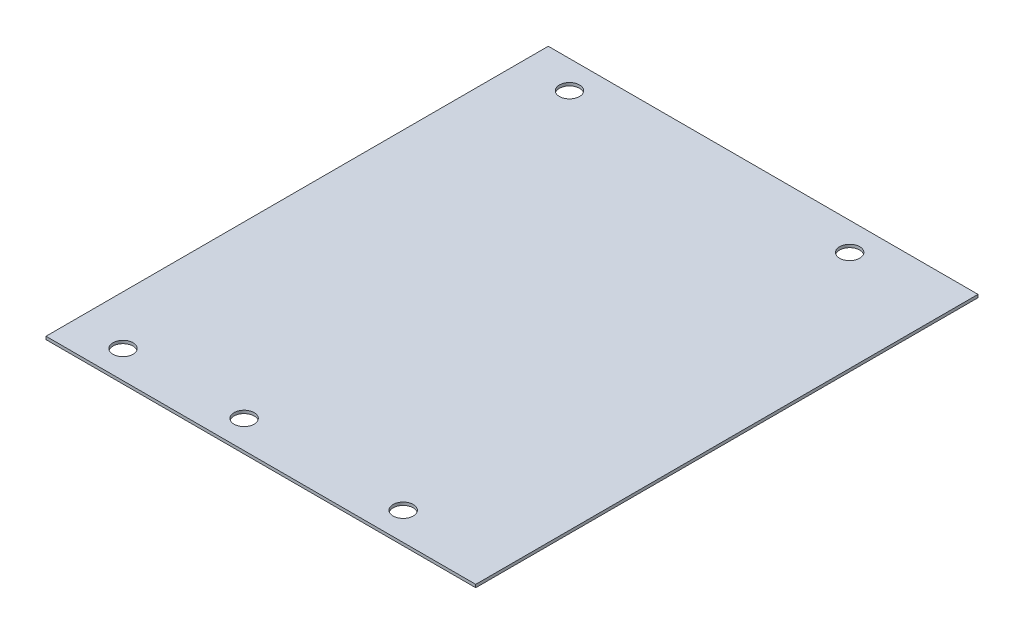
ISO-10303-21;
HEADER;
FILE_DESCRIPTION(('STEP AP214'),'2;1');
FILE_NAME('part.step','',(''),(''),'','','');
FILE_SCHEMA(('AUTOMOTIVE_DESIGN { 1 0 10303 214 1 1 1 1 }'));
ENDSEC;
DATA;
#1=APPLICATION_CONTEXT('core data for automotive mechanical design processes');
#2=APPLICATION_PROTOCOL_DEFINITION('international standard','automotive_design',2000,#1);
#3=PRODUCT_CONTEXT('',#1,'mechanical');
#4=PRODUCT('Part','Part','',(#3));
#5=PRODUCT_RELATED_PRODUCT_CATEGORY('part','',(#4));
#6=PRODUCT_DEFINITION_FORMATION('','',#4);
#7=PRODUCT_DEFINITION_CONTEXT('part definition',#1,'design');
#8=PRODUCT_DEFINITION('design','',#6,#7);
#9=PRODUCT_DEFINITION_SHAPE('','',#8);
#10=(LENGTH_UNIT() NAMED_UNIT(*) SI_UNIT(.MILLI.,.METRE.));
#11=(NAMED_UNIT(*) PLANE_ANGLE_UNIT() SI_UNIT($,.RADIAN.));
#12=(NAMED_UNIT(*) SI_UNIT($,.STERADIAN.) SOLID_ANGLE_UNIT());
#13=UNCERTAINTY_MEASURE_WITH_UNIT(LENGTH_MEASURE(1.E-05),#10,'distance_accuracy_value','');
#14=(GEOMETRIC_REPRESENTATION_CONTEXT(3) GLOBAL_UNCERTAINTY_ASSIGNED_CONTEXT((#13)) GLOBAL_UNIT_ASSIGNED_CONTEXT((#10,
#11,#12)) REPRESENTATION_CONTEXT('',''));
#15=CARTESIAN_POINT('',(0.,0.,0.));
#16=DIRECTION('',(0.,0.,1.));
#17=DIRECTION('',(1.,0.,0.));
#18=AXIS2_PLACEMENT_3D('',#15,#16,#17);
#19=CARTESIAN_POINT('',(-192.5,2.66,225.));
#20=DIRECTION('',(1.,0.,0.));
#21=DIRECTION('',(0.,0.,-1.));
#22=AXIS2_PLACEMENT_3D('',#19,#20,#21);
#23=PLANE('',#22);
#24=DIRECTION('',(0.,0.,1.));
#25=VECTOR('',#24,1.);
#26=CARTESIAN_POINT('',(-192.5,0.,225.));
#27=LINE('',#26,#25);
#28=CARTESIAN_POINT('',(-192.5,0.,-225.));
#29=VERTEX_POINT('',#28);
#30=CARTESIAN_POINT('',(-192.5,0.,225.));
#31=VERTEX_POINT('',#30);
#32=EDGE_CURVE('E100',#29,#31,#27,.T.);
#33=ORIENTED_EDGE('',*,*,#32,.T.);
#34=DIRECTION('',(0.,-1.,0.));
#35=VECTOR('',#34,1.);
#36=CARTESIAN_POINT('',(-192.5,2.66,225.));
#37=LINE('',#36,#35);
#38=CARTESIAN_POINT('',(-192.5,2.66,225.));
#39=VERTEX_POINT('',#38);
#40=EDGE_CURVE('E11',#39,#31,#37,.T.);
#41=ORIENTED_EDGE('',*,*,#40,.F.);
#42=DIRECTION('',(0.,0.,1.));
#43=VECTOR('',#42,1.);
#44=CARTESIAN_POINT('',(-192.5,2.66,225.));
#45=LINE('',#44,#43);
#46=CARTESIAN_POINT('',(-192.5,2.66,-225.));
#47=VERTEX_POINT('',#46);
#48=EDGE_CURVE('E87',#47,#39,#45,.T.);
#49=ORIENTED_EDGE('',*,*,#48,.F.);
#50=DIRECTION('',(0.,-1.,0.));
#51=VECTOR('',#50,1.);
#52=CARTESIAN_POINT('',(-192.5,2.66,-225.));
#53=LINE('',#52,#51);
#54=EDGE_CURVE('E96',#47,#29,#53,.T.);
#55=ORIENTED_EDGE('',*,*,#54,.T.);
#56=EDGE_LOOP('',(#33,#41,#49,#55));
#57=FACE_BOUND('',#56,.T.);
#58=ADVANCED_FACE('F34',(#57),#23,.F.);
#59=CARTESIAN_POINT('',(192.5,2.66,225.));
#60=DIRECTION('',(0.,0.,-1.));
#61=DIRECTION('',(-1.,0.,0.));
#62=AXIS2_PLACEMENT_3D('',#59,#60,#61);
#63=PLANE('',#62);
#64=DIRECTION('',(1.,0.,0.));
#65=VECTOR('',#64,1.);
#66=CARTESIAN_POINT('',(192.5,0.,225.));
#67=LINE('',#66,#65);
#68=CARTESIAN_POINT('',(192.5,0.,225.));
#69=VERTEX_POINT('',#68);
#70=EDGE_CURVE('E91',#31,#69,#67,.T.);
#71=ORIENTED_EDGE('',*,*,#70,.T.);
#72=DIRECTION('',(0.,-1.,0.));
#73=VECTOR('',#72,1.);
#74=CARTESIAN_POINT('',(192.5,2.66,225.));
#75=LINE('',#74,#73);
#76=CARTESIAN_POINT('',(192.5,2.66,225.));
#77=VERTEX_POINT('',#76);
#78=EDGE_CURVE('E43',#77,#69,#75,.T.);
#79=ORIENTED_EDGE('',*,*,#78,.F.);
#80=DIRECTION('',(1.,0.,0.));
#81=VECTOR('',#80,1.);
#82=CARTESIAN_POINT('',(192.5,2.66,225.));
#83=LINE('',#82,#81);
#84=EDGE_CURVE('E82',#39,#77,#83,.T.);
#85=ORIENTED_EDGE('',*,*,#84,.F.);
#86=ORIENTED_EDGE('',*,*,#40,.T.);
#87=EDGE_LOOP('',(#71,#79,#85,#86));
#88=FACE_BOUND('',#87,.T.);
#89=ADVANCED_FACE('F90',(#88),#63,.F.);
#90=CARTESIAN_POINT('',(192.5,2.66,225.));
#91=DIRECTION('',(-1.,0.,0.));
#92=DIRECTION('',(0.,0.,1.));
#93=AXIS2_PLACEMENT_3D('',#90,#91,#92);
#94=PLANE('',#93);
#95=DIRECTION('',(0.,0.,-1.));
#96=VECTOR('',#95,1.);
#97=CARTESIAN_POINT('',(192.5,0.,225.));
#98=LINE('',#97,#96);
#99=CARTESIAN_POINT('',(192.5,0.,-225.));
#100=VERTEX_POINT('',#99);
#101=EDGE_CURVE('E69',#69,#100,#98,.T.);
#102=ORIENTED_EDGE('',*,*,#101,.T.);
#103=DIRECTION('',(0.,-1.,0.));
#104=VECTOR('',#103,1.);
#105=CARTESIAN_POINT('',(192.5,2.66,-225.));
#106=LINE('',#105,#104);
#107=CARTESIAN_POINT('',(192.5,2.66,-225.));
#108=VERTEX_POINT('',#107);
#109=EDGE_CURVE('E92',#108,#100,#106,.T.);
#110=ORIENTED_EDGE('',*,*,#109,.F.);
#111=DIRECTION('',(0.,0.,-1.));
#112=VECTOR('',#111,1.);
#113=CARTESIAN_POINT('',(192.5,2.66,225.));
#114=LINE('',#113,#112);
#115=EDGE_CURVE('E85',#77,#108,#114,.T.);
#116=ORIENTED_EDGE('',*,*,#115,.F.);
#117=ORIENTED_EDGE('',*,*,#78,.T.);
#118=EDGE_LOOP('',(#102,#110,#116,#117));
#119=FACE_BOUND('',#118,.T.);
#120=ADVANCED_FACE('F94',(#119),#94,.F.);
#121=CARTESIAN_POINT('',(192.5,2.66,-225.));
#122=DIRECTION('',(0.,0.,1.));
#123=DIRECTION('',(1.,0.,0.));
#124=AXIS2_PLACEMENT_3D('',#121,#122,#123);
#125=PLANE('',#124);
#126=DIRECTION('',(-1.,0.,0.));
#127=VECTOR('',#126,1.);
#128=CARTESIAN_POINT('',(192.5,0.,-225.));
#129=LINE('',#128,#127);
#130=EDGE_CURVE('E75',#100,#29,#129,.T.);
#131=ORIENTED_EDGE('',*,*,#130,.T.);
#132=ORIENTED_EDGE('',*,*,#54,.F.);
#133=DIRECTION('',(-1.,0.,0.));
#134=VECTOR('',#133,1.);
#135=CARTESIAN_POINT('',(192.5,2.66,-225.));
#136=LINE('',#135,#134);
#137=EDGE_CURVE('E52',#108,#47,#136,.T.);
#138=ORIENTED_EDGE('',*,*,#137,.F.);
#139=ORIENTED_EDGE('',*,*,#109,.T.);
#140=EDGE_LOOP('',(#131,#132,#138,#139));
#141=FACE_BOUND('',#140,.T.);
#142=ADVANCED_FACE('F148',(#141),#125,.F.);
#143=CARTESIAN_POINT('',(0.,2.66,0.));
#144=DIRECTION('',(0.,1.,0.));
#145=DIRECTION('',(0.,0.,1.));
#146=AXIS2_PLACEMENT_3D('',#143,#144,#145);
#147=PLANE('',#146);
#148=CARTESIAN_POINT('',(102.5,2.66,200.));
#149=DIRECTION('',(0.,1.,0.));
#150=DIRECTION('',(0.,0.,1.));
#151=AXIS2_PLACEMENT_3D('',#148,#149,#150);
#152=CIRCLE('',#151,9.);
#153=CARTESIAN_POINT('',(102.5,2.66,209.));
#154=VERTEX_POINT('',#153);
#155=EDGE_CURVE('E136',#154,#154,#152,.T.);
#156=ORIENTED_EDGE('',*,*,#155,.F.);
#157=EDGE_LOOP('',(#156));
#158=FACE_BOUND('',#157,.T.);
#159=CARTESIAN_POINT('',(-40.,2.66,200.));
#160=DIRECTION('',(0.,1.,0.));
#161=DIRECTION('',(0.,0.,1.));
#162=AXIS2_PLACEMENT_3D('',#159,#160,#161);
#163=CIRCLE('',#162,9.00000000000001);
#164=CARTESIAN_POINT('',(-40.,2.66,209.));
#165=VERTEX_POINT('',#164);
#166=EDGE_CURVE('E133',#165,#165,#163,.T.);
#167=ORIENTED_EDGE('',*,*,#166,.F.);
#168=EDGE_LOOP('',(#167));
#169=FACE_BOUND('',#168,.T.);
#170=CARTESIAN_POINT('',(-148.5,2.66,200.));
#171=DIRECTION('',(0.,1.,0.));
#172=DIRECTION('',(0.,0.,1.));
#173=AXIS2_PLACEMENT_3D('',#170,#171,#172);
#174=CIRCLE('',#173,9.00000000000001);
#175=CARTESIAN_POINT('',(-148.5,2.66,209.));
#176=VERTEX_POINT('',#175);
#177=EDGE_CURVE('E130',#176,#176,#174,.T.);
#178=ORIENTED_EDGE('',*,*,#177,.F.);
#179=EDGE_LOOP('',(#178));
#180=FACE_BOUND('',#179,.T.);
#181=CARTESIAN_POINT('',(102.5,2.66,-200.));
#182=DIRECTION('',(0.,1.,0.));
#183=DIRECTION('',(0.,0.,1.));
#184=AXIS2_PLACEMENT_3D('',#181,#182,#183);
#185=CIRCLE('',#184,9.00000000000001);
#186=CARTESIAN_POINT('',(102.5,2.66,-191.));
#187=VERTEX_POINT('',#186);
#188=EDGE_CURVE('E116',#187,#187,#185,.T.);
#189=ORIENTED_EDGE('',*,*,#188,.F.);
#190=EDGE_LOOP('',(#189));
#191=FACE_BOUND('',#190,.T.);
#192=CARTESIAN_POINT('',(-148.5,2.66,-200.));
#193=DIRECTION('',(0.,1.,0.));
#194=DIRECTION('',(0.,0.,1.));
#195=AXIS2_PLACEMENT_3D('',#192,#193,#194);
#196=CIRCLE('',#195,9.00000000000001);
#197=CARTESIAN_POINT('',(-148.5,2.66,-191.));
#198=VERTEX_POINT('',#197);
#199=EDGE_CURVE('E111',#198,#198,#196,.T.);
#200=ORIENTED_EDGE('',*,*,#199,.F.);
#201=EDGE_LOOP('',(#200));
#202=FACE_BOUND('',#201,.T.);
#203=ORIENTED_EDGE('',*,*,#48,.T.);
#204=ORIENTED_EDGE('',*,*,#84,.T.);
#205=ORIENTED_EDGE('',*,*,#115,.T.);
#206=ORIENTED_EDGE('',*,*,#137,.T.);
#207=EDGE_LOOP('',(#203,#204,#205,#206));
#208=FACE_BOUND('',#207,.T.);
#209=ADVANCED_FACE('F83',(#158,#169,#180,#191,#202,#208),#147,.T.);
#210=CARTESIAN_POINT('',(0.,0.,0.));
#211=DIRECTION('',(0.,1.,0.));
#212=DIRECTION('',(0.,0.,1.));
#213=AXIS2_PLACEMENT_3D('',#210,#211,#212);
#214=PLANE('',#213);
#215=CARTESIAN_POINT('',(102.5,0.,200.));
#216=DIRECTION('',(0.,1.,0.));
#217=DIRECTION('',(0.,0.,1.));
#218=AXIS2_PLACEMENT_3D('',#215,#216,#217);
#219=CIRCLE('',#218,9.);
#220=CARTESIAN_POINT('',(102.5,0.,209.));
#221=VERTEX_POINT('',#220);
#222=EDGE_CURVE('E37',#221,#221,#219,.T.);
#223=ORIENTED_EDGE('',*,*,#222,.T.);
#224=EDGE_LOOP('',(#223));
#225=FACE_BOUND('',#224,.T.);
#226=CARTESIAN_POINT('',(-40.,0.,200.));
#227=DIRECTION('',(0.,1.,0.));
#228=DIRECTION('',(0.,0.,1.));
#229=AXIS2_PLACEMENT_3D('',#226,#227,#228);
#230=CIRCLE('',#229,9.00000000000001);
#231=CARTESIAN_POINT('',(-40.,0.,209.));
#232=VERTEX_POINT('',#231);
#233=EDGE_CURVE('E118',#232,#232,#230,.T.);
#234=ORIENTED_EDGE('',*,*,#233,.T.);
#235=EDGE_LOOP('',(#234));
#236=FACE_BOUND('',#235,.T.);
#237=CARTESIAN_POINT('',(-148.5,0.,200.));
#238=DIRECTION('',(0.,1.,0.));
#239=DIRECTION('',(0.,0.,1.));
#240=AXIS2_PLACEMENT_3D('',#237,#238,#239);
#241=CIRCLE('',#240,9.00000000000001);
#242=CARTESIAN_POINT('',(-148.5,0.,209.));
#243=VERTEX_POINT('',#242);
#244=EDGE_CURVE('E115',#243,#243,#241,.T.);
#245=ORIENTED_EDGE('',*,*,#244,.T.);
#246=EDGE_LOOP('',(#245));
#247=FACE_BOUND('',#246,.T.);
#248=CARTESIAN_POINT('',(102.5,0.,-200.));
#249=DIRECTION('',(0.,1.,0.));
#250=DIRECTION('',(0.,0.,1.));
#251=AXIS2_PLACEMENT_3D('',#248,#249,#250);
#252=CIRCLE('',#251,9.00000000000001);
#253=CARTESIAN_POINT('',(102.5,0.,-191.));
#254=VERTEX_POINT('',#253);
#255=EDGE_CURVE('E112',#254,#254,#252,.T.);
#256=ORIENTED_EDGE('',*,*,#255,.T.);
#257=EDGE_LOOP('',(#256));
#258=FACE_BOUND('',#257,.T.);
#259=CARTESIAN_POINT('',(-148.5,0.,-200.));
#260=DIRECTION('',(0.,1.,0.));
#261=DIRECTION('',(0.,0.,1.));
#262=AXIS2_PLACEMENT_3D('',#259,#260,#261);
#263=CIRCLE('',#262,9.00000000000001);
#264=CARTESIAN_POINT('',(-148.5,0.,-191.));
#265=VERTEX_POINT('',#264);
#266=EDGE_CURVE('E103',#265,#265,#263,.T.);
#267=ORIENTED_EDGE('',*,*,#266,.T.);
#268=EDGE_LOOP('',(#267));
#269=FACE_BOUND('',#268,.T.);
#270=ORIENTED_EDGE('',*,*,#32,.F.);
#271=ORIENTED_EDGE('',*,*,#130,.F.);
#272=ORIENTED_EDGE('',*,*,#101,.F.);
#273=ORIENTED_EDGE('',*,*,#70,.F.);
#274=EDGE_LOOP('',(#270,#271,#272,#273));
#275=FACE_BOUND('',#274,.T.);
#276=ADVANCED_FACE('F147',(#225,#236,#247,#258,#269,#275),#214,.F.);
#277=CARTESIAN_POINT('',(-148.5,-0.34,-200.));
#278=DIRECTION('',(0.,1.,0.));
#279=DIRECTION('',(0.,0.,1.));
#280=AXIS2_PLACEMENT_3D('',#277,#278,#279);
#281=CYLINDRICAL_SURFACE('',#280,9.00000000000001);
#282=ORIENTED_EDGE('',*,*,#199,.T.);
#283=EDGE_LOOP('',(#282));
#284=FACE_BOUND('',#283,.T.);
#285=ORIENTED_EDGE('',*,*,#266,.F.);
#286=EDGE_LOOP('',(#285));
#287=FACE_BOUND('',#286,.T.);
#288=ADVANCED_FACE('F160',(#284,#287),#281,.F.);
#289=CARTESIAN_POINT('',(102.5,-0.34,-200.));
#290=DIRECTION('',(0.,1.,0.));
#291=DIRECTION('',(0.,0.,1.));
#292=AXIS2_PLACEMENT_3D('',#289,#290,#291);
#293=CYLINDRICAL_SURFACE('',#292,9.00000000000001);
#294=ORIENTED_EDGE('',*,*,#188,.T.);
#295=EDGE_LOOP('',(#294));
#296=FACE_BOUND('',#295,.T.);
#297=ORIENTED_EDGE('',*,*,#255,.F.);
#298=EDGE_LOOP('',(#297));
#299=FACE_BOUND('',#298,.T.);
#300=ADVANCED_FACE('F156',(#296,#299),#293,.F.);
#301=CARTESIAN_POINT('',(-148.5,-0.34,200.));
#302=DIRECTION('',(0.,1.,0.));
#303=DIRECTION('',(0.,0.,1.));
#304=AXIS2_PLACEMENT_3D('',#301,#302,#303);
#305=CYLINDRICAL_SURFACE('',#304,9.00000000000001);
#306=ORIENTED_EDGE('',*,*,#177,.T.);
#307=EDGE_LOOP('',(#306));
#308=FACE_BOUND('',#307,.T.);
#309=ORIENTED_EDGE('',*,*,#244,.F.);
#310=EDGE_LOOP('',(#309));
#311=FACE_BOUND('',#310,.T.);
#312=ADVANCED_FACE('F159',(#308,#311),#305,.F.);
#313=CARTESIAN_POINT('',(-40.,-0.34,200.));
#314=DIRECTION('',(0.,1.,0.));
#315=DIRECTION('',(0.,0.,1.));
#316=AXIS2_PLACEMENT_3D('',#313,#314,#315);
#317=CYLINDRICAL_SURFACE('',#316,9.00000000000001);
#318=ORIENTED_EDGE('',*,*,#166,.T.);
#319=EDGE_LOOP('',(#318));
#320=FACE_BOUND('',#319,.T.);
#321=ORIENTED_EDGE('',*,*,#233,.F.);
#322=EDGE_LOOP('',(#321));
#323=FACE_BOUND('',#322,.T.);
#324=ADVANCED_FACE('F142',(#320,#323),#317,.F.);
#325=CARTESIAN_POINT('',(102.5,-0.34,200.));
#326=DIRECTION('',(0.,1.,0.));
#327=DIRECTION('',(0.,0.,1.));
#328=AXIS2_PLACEMENT_3D('',#325,#326,#327);
#329=CYLINDRICAL_SURFACE('',#328,9.);
#330=ORIENTED_EDGE('',*,*,#155,.T.);
#331=EDGE_LOOP('',(#330));
#332=FACE_BOUND('',#331,.T.);
#333=ORIENTED_EDGE('',*,*,#222,.F.);
#334=EDGE_LOOP('',(#333));
#335=FACE_BOUND('',#334,.T.);
#336=ADVANCED_FACE('F235',(#332,#335),#329,.F.);
#337=CLOSED_SHELL('',(#58,#89,#120,#142,#209,#276,#288,#300,#312,#324,#336));
#338=MANIFOLD_SOLID_BREP('B2',#337);
#339=ADVANCED_BREP_SHAPE_REPRESENTATION('',(#18,#338),#14);
#340=SHAPE_DEFINITION_REPRESENTATION(#9,#339);
ENDSEC;
END-ISO-10303-21;
